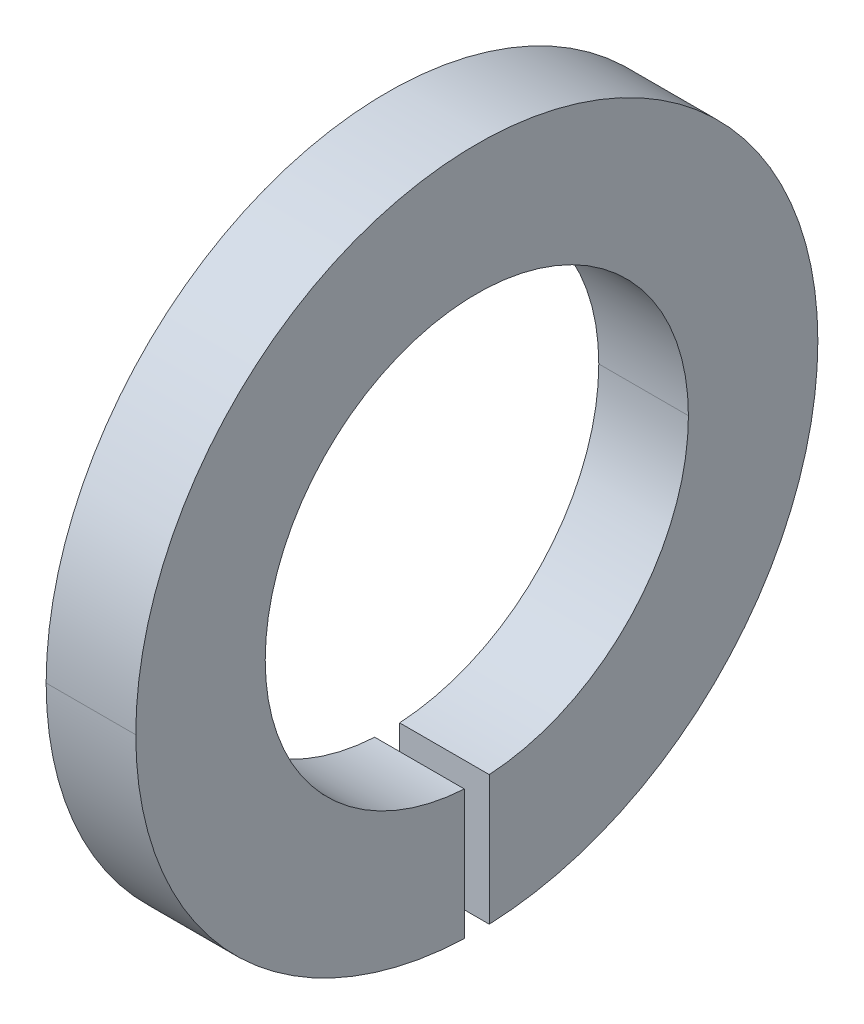
ISO-10303-21;
HEADER;
FILE_DESCRIPTION(('STEP AP214'),'2;1');
FILE_NAME('part.step','',(''),(''),'','','');
FILE_SCHEMA(('AUTOMOTIVE_DESIGN { 1 0 10303 214 1 1 1 1 }'));
ENDSEC;
DATA;
#1=APPLICATION_CONTEXT('core data for automotive mechanical design processes');
#2=APPLICATION_PROTOCOL_DEFINITION('international standard','automotive_design',2000,#1);
#3=PRODUCT_CONTEXT('',#1,'mechanical');
#4=PRODUCT('Part','Part','',(#3));
#5=PRODUCT_RELATED_PRODUCT_CATEGORY('part','',(#4));
#6=PRODUCT_DEFINITION_FORMATION('','',#4);
#7=PRODUCT_DEFINITION_CONTEXT('part definition',#1,'design');
#8=PRODUCT_DEFINITION('design','',#6,#7);
#9=PRODUCT_DEFINITION_SHAPE('','',#8);
#10=(LENGTH_UNIT() NAMED_UNIT(*) SI_UNIT(.MILLI.,.METRE.));
#11=(NAMED_UNIT(*) PLANE_ANGLE_UNIT() SI_UNIT($,.RADIAN.));
#12=(NAMED_UNIT(*) SI_UNIT($,.STERADIAN.) SOLID_ANGLE_UNIT());
#13=UNCERTAINTY_MEASURE_WITH_UNIT(LENGTH_MEASURE(1.E-05),#10,'distance_accuracy_value','');
#14=(GEOMETRIC_REPRESENTATION_CONTEXT(3) GLOBAL_UNCERTAINTY_ASSIGNED_CONTEXT((#13)) GLOBAL_UNIT_ASSIGNED_CONTEXT((#10,
#11,#12)) REPRESENTATION_CONTEXT('',''));
#15=CARTESIAN_POINT('',(0.,0.,0.));
#16=DIRECTION('',(0.,0.,1.));
#17=DIRECTION('',(1.,0.,0.));
#18=AXIS2_PLACEMENT_3D('',#15,#16,#17);
#19=CARTESIAN_POINT('',(24.143011733533,-4.49394145574459,68.903143359205));
#20=DIRECTION('',(0.,0.,1.));
#21=DIRECTION('',(0.,-1.,0.));
#22=AXIS2_PLACEMENT_3D('',#19,#20,#21);
#23=PLANE('',#22);
#24=DIRECTION('',(1.,0.,0.));
#25=VECTOR('',#24,1.);
#26=CARTESIAN_POINT('',(17.143011733533,-9.15769860381393,68.903143359205));
#27=LINE('',#26,#25);
#28=CARTESIAN_POINT('',(15.343011733533,-9.15769860381393,68.903143359205));
#29=VERTEX_POINT('',#28);
#30=CARTESIAN_POINT('',(17.143011733533,-9.15769860381393,68.903143359205));
#31=VERTEX_POINT('',#30);
#32=EDGE_CURVE('E26',#29,#31,#27,.T.);
#33=ORIENTED_EDGE('',*,*,#32,.T.);
#34=DIRECTION('',(0.,-1.,0.));
#35=VECTOR('',#34,1.);
#36=CARTESIAN_POINT('',(17.143011733533,-2.312262167764,68.903143359205));
#37=LINE('',#36,#35);
#38=CARTESIAN_POINT('',(17.143011733533,-6.55490285488328,68.903143359205));
#39=VERTEX_POINT('',#38);
#40=EDGE_CURVE('E125',#39,#31,#37,.T.);
#41=ORIENTED_EDGE('',*,*,#40,.F.);
#42=DIRECTION('',(1.,0.,0.));
#43=VECTOR('',#42,1.);
#44=CARTESIAN_POINT('',(17.143011733533,-6.55490285488328,68.903143359205));
#45=LINE('',#44,#43);
#46=CARTESIAN_POINT('',(15.343011733533,-6.55490285488328,68.903143359205));
#47=VERTEX_POINT('',#46);
#48=EDGE_CURVE('E123',#47,#39,#45,.T.);
#49=ORIENTED_EDGE('',*,*,#48,.F.);
#50=DIRECTION('',(0.,1.,0.));
#51=VECTOR('',#50,1.);
#52=CARTESIAN_POINT('',(15.343011733533,-4.49394145574459,68.903143359205));
#53=LINE('',#52,#51);
#54=EDGE_CURVE('E108',#29,#47,#53,.T.);
#55=ORIENTED_EDGE('',*,*,#54,.F.);
#56=EDGE_LOOP('',(#33,#41,#49,#55));
#57=FACE_BOUND('',#56,.T.);
#58=ADVANCED_FACE('F17',(#57),#23,.T.);
#59=CARTESIAN_POINT('',(24.143011733533,-4.47733628969292,69.403143359205));
#60=DIRECTION('',(0.,0.,-1.));
#61=DIRECTION('',(-1.,0.,0.));
#62=AXIS2_PLACEMENT_3D('',#59,#60,#61);
#63=PLANE('',#62);
#64=DIRECTION('',(-1.,0.,0.));
#65=VECTOR('',#64,1.);
#66=CARTESIAN_POINT('',(17.143011733533,-9.15769860381393,69.403143359205));
#67=LINE('',#66,#65);
#68=CARTESIAN_POINT('',(17.143011733533,-9.15769860381393,69.403143359205));
#69=VERTEX_POINT('',#68);
#70=CARTESIAN_POINT('',(15.343011733533,-9.15769860381393,69.403143359205));
#71=VERTEX_POINT('',#70);
#72=EDGE_CURVE('E142',#69,#71,#67,.T.);
#73=ORIENTED_EDGE('',*,*,#72,.T.);
#74=DIRECTION('',(0.,-1.,0.));
#75=VECTOR('',#74,1.);
#76=CARTESIAN_POINT('',(15.343011733533,-4.47733628969292,69.403143359205));
#77=LINE('',#76,#75);
#78=CARTESIAN_POINT('',(15.343011733533,-6.55490285488328,69.403143359205));
#79=VERTEX_POINT('',#78);
#80=EDGE_CURVE('E183',#79,#71,#77,.T.);
#81=ORIENTED_EDGE('',*,*,#80,.F.);
#82=DIRECTION('',(-1.,0.,0.));
#83=VECTOR('',#82,1.);
#84=CARTESIAN_POINT('',(17.143011733533,-6.55490285488328,69.403143359205));
#85=LINE('',#84,#83);
#86=CARTESIAN_POINT('',(17.143011733533,-6.55490285488328,69.403143359205));
#87=VERTEX_POINT('',#86);
#88=EDGE_CURVE('E11',#87,#79,#85,.T.);
#89=ORIENTED_EDGE('',*,*,#88,.F.);
#90=DIRECTION('',(0.,1.,0.));
#91=VECTOR('',#90,1.);
#92=CARTESIAN_POINT('',(17.143011733533,-2.312262167764,69.403143359205));
#93=LINE('',#92,#91);
#94=EDGE_CURVE('E82',#69,#87,#93,.T.);
#95=ORIENTED_EDGE('',*,*,#94,.F.);
#96=EDGE_LOOP('',(#73,#81,#89,#95));
#97=FACE_BOUND('',#96,.T.);
#98=ADVANCED_FACE('F205',(#97),#63,.T.);
#99=CARTESIAN_POINT('',(17.143011733533,-2.312262167764,69.153143359205));
#100=DIRECTION('',(-1.,0.,0.));
#101=DIRECTION('',(0.,0.,-1.));
#102=AXIS2_PLACEMENT_3D('',#99,#100,#101);
#103=CYLINDRICAL_SURFACE('',#102,4.25);
#104=DIRECTION('',(-1.,0.,0.));
#105=VECTOR('',#104,1.);
#106=CARTESIAN_POINT('',(17.143011733533,-2.312262167764,73.403143359205));
#107=LINE('',#106,#105);
#108=CARTESIAN_POINT('',(17.143011733533,-2.312262167764,73.403143359205));
#109=VERTEX_POINT('',#108);
#110=CARTESIAN_POINT('',(15.343011733533,-2.312262167764,73.403143359205));
#111=VERTEX_POINT('',#110);
#112=EDGE_CURVE('E150',#109,#111,#107,.T.);
#113=ORIENTED_EDGE('',*,*,#112,.F.);
#114=CARTESIAN_POINT('',(17.143011733533,-2.312262167764,69.153143359205));
#115=DIRECTION('',(1.,0.,0.));
#116=DIRECTION('',(0.,0.,-1.));
#117=AXIS2_PLACEMENT_3D('',#114,#115,#116);
#118=CIRCLE('',#117,4.25);
#119=EDGE_CURVE('E119',#109,#87,#118,.T.);
#120=ORIENTED_EDGE('',*,*,#119,.T.);
#121=ORIENTED_EDGE('',*,*,#88,.T.);
#122=CARTESIAN_POINT('',(15.343011733533,-2.312262167764,69.153143359205));
#123=DIRECTION('',(1.,0.,0.));
#124=DIRECTION('',(0.,0.,-1.));
#125=AXIS2_PLACEMENT_3D('',#122,#123,#124);
#126=CIRCLE('',#125,4.25);
#127=EDGE_CURVE('E118',#111,#79,#126,.T.);
#128=ORIENTED_EDGE('',*,*,#127,.F.);
#129=EDGE_LOOP('',(#113,#120,#121,#128));
#130=FACE_BOUND('',#129,.T.);
#131=ADVANCED_FACE('F226',(#130),#103,.F.);
#132=CARTESIAN_POINT('',(17.143011733533,-2.312262167764,69.153143359205));
#133=DIRECTION('',(-1.,0.,0.));
#134=DIRECTION('',(0.,0.,-1.));
#135=AXIS2_PLACEMENT_3D('',#132,#133,#134);
#136=CYLINDRICAL_SURFACE('',#135,6.85);
#137=DIRECTION('',(-1.,0.,0.));
#138=VECTOR('',#137,1.);
#139=CARTESIAN_POINT('',(17.143011733533,-2.312262167764,62.303143359205));
#140=LINE('',#139,#138);
#141=CARTESIAN_POINT('',(17.143011733533,-2.312262167764,62.303143359205));
#142=VERTEX_POINT('',#141);
#143=CARTESIAN_POINT('',(15.343011733533,-2.312262167764,62.303143359205));
#144=VERTEX_POINT('',#143);
#145=EDGE_CURVE('E159',#142,#144,#140,.T.);
#146=ORIENTED_EDGE('',*,*,#145,.F.);
#147=CARTESIAN_POINT('',(17.143011733533,-2.312262167764,69.153143359205));
#148=DIRECTION('',(1.,0.,0.));
#149=DIRECTION('',(0.,0.,-1.));
#150=AXIS2_PLACEMENT_3D('',#147,#148,#149);
#151=CIRCLE('',#150,6.85);
#152=EDGE_CURVE('E144',#31,#142,#151,.T.);
#153=ORIENTED_EDGE('',*,*,#152,.F.);
#154=ORIENTED_EDGE('',*,*,#32,.F.);
#155=CARTESIAN_POINT('',(15.343011733533,-2.312262167764,69.153143359205));
#156=DIRECTION('',(1.,0.,0.));
#157=DIRECTION('',(0.,0.,-1.));
#158=AXIS2_PLACEMENT_3D('',#155,#156,#157);
#159=CIRCLE('',#158,6.85);
#160=EDGE_CURVE('E114',#29,#144,#159,.T.);
#161=ORIENTED_EDGE('',*,*,#160,.T.);
#162=EDGE_LOOP('',(#146,#153,#154,#161));
#163=FACE_BOUND('',#162,.T.);
#164=ADVANCED_FACE('F193',(#163),#136,.T.);
#165=CARTESIAN_POINT('',(15.343011733533,-2.312262167764,69.153143359205));
#166=DIRECTION('',(1.,0.,0.));
#167=DIRECTION('',(0.,1.,0.));
#168=AXIS2_PLACEMENT_3D('',#165,#166,#167);
#169=PLANE('',#168);
#170=ORIENTED_EDGE('',*,*,#54,.T.);
#171=CARTESIAN_POINT('',(15.343011733533,-2.312262167764,69.153143359205));
#172=DIRECTION('',(1.,0.,0.));
#173=DIRECTION('',(0.,0.,-1.));
#174=AXIS2_PLACEMENT_3D('',#171,#172,#173);
#175=CIRCLE('',#174,4.25);
#176=CARTESIAN_POINT('',(15.343011733533,-2.312262167764,64.903143359205));
#177=VERTEX_POINT('',#176);
#178=EDGE_CURVE('E112',#47,#177,#175,.T.);
#179=ORIENTED_EDGE('',*,*,#178,.T.);
#180=CARTESIAN_POINT('',(15.343011733533,-2.312262167764,69.153143359205));
#181=DIRECTION('',(1.,0.,0.));
#182=DIRECTION('',(0.,0.,-1.));
#183=AXIS2_PLACEMENT_3D('',#180,#181,#182);
#184=CIRCLE('',#183,4.25);
#185=EDGE_CURVE('E102',#177,#111,#184,.T.);
#186=ORIENTED_EDGE('',*,*,#185,.T.);
#187=ORIENTED_EDGE('',*,*,#127,.T.);
#188=ORIENTED_EDGE('',*,*,#80,.T.);
#189=CARTESIAN_POINT('',(15.343011733533,-2.312262167764,69.153143359205));
#190=DIRECTION('',(1.,0.,0.));
#191=DIRECTION('',(0.,0.,-1.));
#192=AXIS2_PLACEMENT_3D('',#189,#190,#191);
#193=CIRCLE('',#192,6.85);
#194=CARTESIAN_POINT('',(15.343011733533,-2.312262167764,76.003143359205));
#195=VERTEX_POINT('',#194);
#196=EDGE_CURVE('E70',#195,#71,#193,.T.);
#197=ORIENTED_EDGE('',*,*,#196,.F.);
#198=CARTESIAN_POINT('',(15.343011733533,-2.312262167764,69.153143359205));
#199=DIRECTION('',(1.,0.,0.));
#200=DIRECTION('',(0.,0.,-1.));
#201=AXIS2_PLACEMENT_3D('',#198,#199,#200);
#202=CIRCLE('',#201,6.85);
#203=EDGE_CURVE('E163',#144,#195,#202,.T.);
#204=ORIENTED_EDGE('',*,*,#203,.F.);
#205=ORIENTED_EDGE('',*,*,#160,.F.);
#206=EDGE_LOOP('',(#170,#179,#186,#187,#188,#197,#204,#205));
#207=FACE_BOUND('',#206,.T.);
#208=ADVANCED_FACE('F110',(#207),#169,.F.);
#209=CARTESIAN_POINT('',(17.143011733533,-2.312262167764,69.153143359205));
#210=DIRECTION('',(1.,0.,0.));
#211=DIRECTION('',(0.,1.,0.));
#212=AXIS2_PLACEMENT_3D('',#209,#210,#211);
#213=PLANE('',#212);
#214=CARTESIAN_POINT('',(17.143011733533,-2.312262167764,69.153143359205));
#215=DIRECTION('',(1.,0.,0.));
#216=DIRECTION('',(0.,0.,-1.));
#217=AXIS2_PLACEMENT_3D('',#214,#215,#216);
#218=CIRCLE('',#217,4.25);
#219=CARTESIAN_POINT('',(17.143011733533,-2.312262167764,64.903143359205));
#220=VERTEX_POINT('',#219);
#221=EDGE_CURVE('E139',#39,#220,#218,.T.);
#222=ORIENTED_EDGE('',*,*,#221,.F.);
#223=ORIENTED_EDGE('',*,*,#40,.T.);
#224=ORIENTED_EDGE('',*,*,#152,.T.);
#225=CARTESIAN_POINT('',(17.143011733533,-2.312262167764,69.153143359205));
#226=DIRECTION('',(1.,0.,0.));
#227=DIRECTION('',(0.,0.,-1.));
#228=AXIS2_PLACEMENT_3D('',#225,#226,#227);
#229=CIRCLE('',#228,6.85);
#230=CARTESIAN_POINT('',(17.143011733533,-2.312262167764,76.003143359205));
#231=VERTEX_POINT('',#230);
#232=EDGE_CURVE('E155',#142,#231,#229,.T.);
#233=ORIENTED_EDGE('',*,*,#232,.T.);
#234=CARTESIAN_POINT('',(17.143011733533,-2.312262167764,69.153143359205));
#235=DIRECTION('',(1.,0.,0.));
#236=DIRECTION('',(0.,0.,-1.));
#237=AXIS2_PLACEMENT_3D('',#234,#235,#236);
#238=CIRCLE('',#237,6.85);
#239=EDGE_CURVE('E170',#231,#69,#238,.T.);
#240=ORIENTED_EDGE('',*,*,#239,.T.);
#241=ORIENTED_EDGE('',*,*,#94,.T.);
#242=ORIENTED_EDGE('',*,*,#119,.F.);
#243=CARTESIAN_POINT('',(17.143011733533,-2.312262167764,69.153143359205));
#244=DIRECTION('',(1.,0.,0.));
#245=DIRECTION('',(0.,0.,-1.));
#246=AXIS2_PLACEMENT_3D('',#243,#244,#245);
#247=CIRCLE('',#246,4.25);
#248=EDGE_CURVE('E130',#220,#109,#247,.T.);
#249=ORIENTED_EDGE('',*,*,#248,.F.);
#250=EDGE_LOOP('',(#222,#223,#224,#233,#240,#241,#242,#249));
#251=FACE_BOUND('',#250,.T.);
#252=ADVANCED_FACE('F196',(#251),#213,.T.);
#253=CARTESIAN_POINT('',(17.143011733533,-2.312262167764,69.153143359205));
#254=DIRECTION('',(-1.,0.,0.));
#255=DIRECTION('',(0.,0.,-1.));
#256=AXIS2_PLACEMENT_3D('',#253,#254,#255);
#257=CYLINDRICAL_SURFACE('',#256,6.85);
#258=ORIENTED_EDGE('',*,*,#239,.F.);
#259=DIRECTION('',(-1.,0.,0.));
#260=VECTOR('',#259,1.);
#261=CARTESIAN_POINT('',(17.143011733533,-2.312262167764,76.003143359205));
#262=LINE('',#261,#260);
#263=EDGE_CURVE('E167',#231,#195,#262,.T.);
#264=ORIENTED_EDGE('',*,*,#263,.T.);
#265=ORIENTED_EDGE('',*,*,#196,.T.);
#266=ORIENTED_EDGE('',*,*,#72,.F.);
#267=EDGE_LOOP('',(#258,#264,#265,#266));
#268=FACE_BOUND('',#267,.T.);
#269=ADVANCED_FACE('F207',(#268),#257,.T.);
#270=CARTESIAN_POINT('',(17.143011733533,-2.312262167764,69.153143359205));
#271=DIRECTION('',(-1.,0.,0.));
#272=DIRECTION('',(0.,0.,-1.));
#273=AXIS2_PLACEMENT_3D('',#270,#271,#272);
#274=CYLINDRICAL_SURFACE('',#273,6.85);
#275=ORIENTED_EDGE('',*,*,#232,.F.);
#276=ORIENTED_EDGE('',*,*,#145,.T.);
#277=ORIENTED_EDGE('',*,*,#203,.T.);
#278=ORIENTED_EDGE('',*,*,#263,.F.);
#279=EDGE_LOOP('',(#275,#276,#277,#278));
#280=FACE_BOUND('',#279,.T.);
#281=ADVANCED_FACE('F211',(#280),#274,.T.);
#282=CARTESIAN_POINT('',(17.143011733533,-2.312262167764,69.153143359205));
#283=DIRECTION('',(-1.,0.,0.));
#284=DIRECTION('',(0.,0.,-1.));
#285=AXIS2_PLACEMENT_3D('',#282,#283,#284);
#286=CYLINDRICAL_SURFACE('',#285,4.25);
#287=DIRECTION('',(-1.,0.,0.));
#288=VECTOR('',#287,1.);
#289=CARTESIAN_POINT('',(17.143011733533,-2.312262167764,64.903143359205));
#290=LINE('',#289,#288);
#291=EDGE_CURVE('E133',#220,#177,#290,.T.);
#292=ORIENTED_EDGE('',*,*,#291,.F.);
#293=ORIENTED_EDGE('',*,*,#248,.T.);
#294=ORIENTED_EDGE('',*,*,#112,.T.);
#295=ORIENTED_EDGE('',*,*,#185,.F.);
#296=EDGE_LOOP('',(#292,#293,#294,#295));
#297=FACE_BOUND('',#296,.T.);
#298=ADVANCED_FACE('F213',(#297),#286,.F.);
#299=CARTESIAN_POINT('',(17.143011733533,-2.312262167764,69.153143359205));
#300=DIRECTION('',(-1.,0.,0.));
#301=DIRECTION('',(0.,0.,-1.));
#302=AXIS2_PLACEMENT_3D('',#299,#300,#301);
#303=CYLINDRICAL_SURFACE('',#302,4.25);
#304=ORIENTED_EDGE('',*,*,#221,.T.);
#305=ORIENTED_EDGE('',*,*,#291,.T.);
#306=ORIENTED_EDGE('',*,*,#178,.F.);
#307=ORIENTED_EDGE('',*,*,#48,.T.);
#308=EDGE_LOOP('',(#304,#305,#306,#307));
#309=FACE_BOUND('',#308,.T.);
#310=ADVANCED_FACE('F132',(#309),#303,.F.);
#311=CLOSED_SHELL('',(#58,#98,#131,#164,#208,#252,#269,#281,#298,#310));
#312=MANIFOLD_SOLID_BREP('B1',#311);
#313=ADVANCED_BREP_SHAPE_REPRESENTATION('',(#18,#312),#14);
#314=SHAPE_DEFINITION_REPRESENTATION(#9,#313);
ENDSEC;
END-ISO-10303-21;
